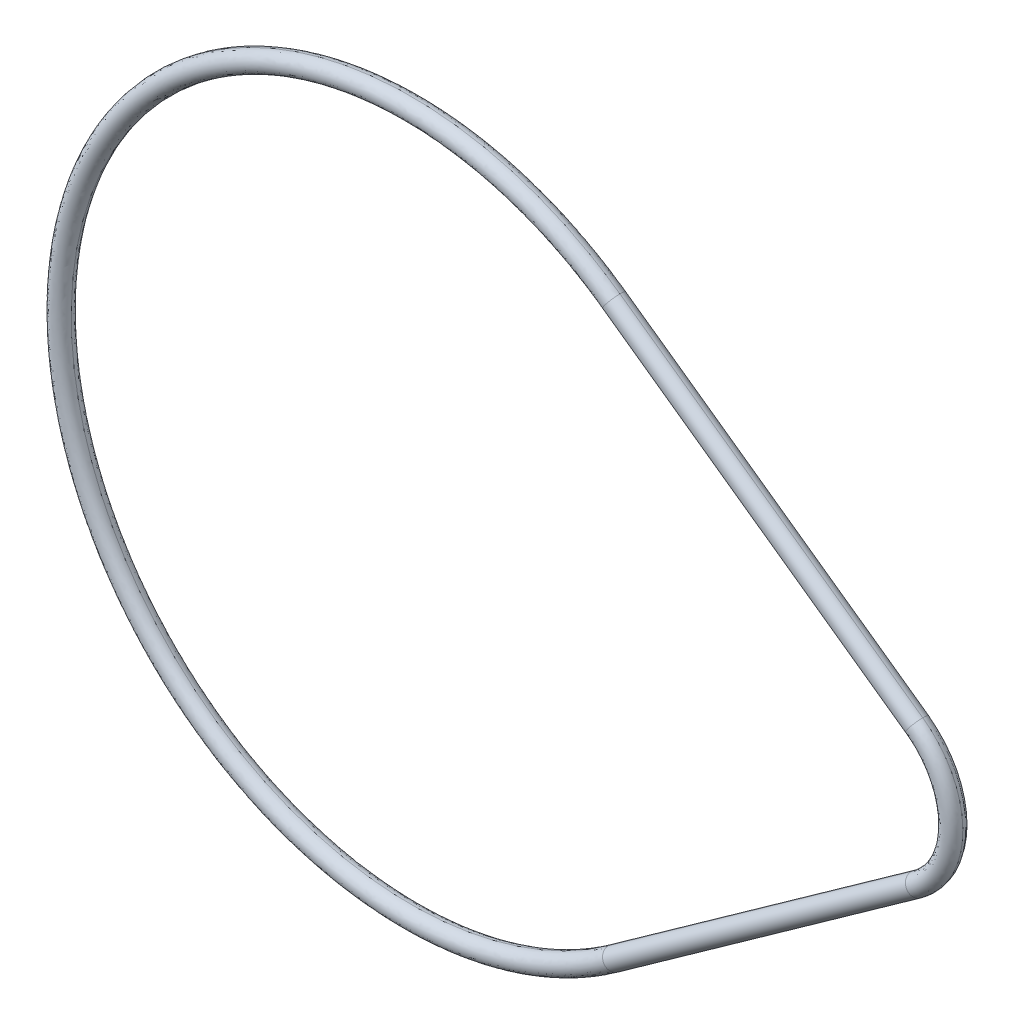
ISO-10303-21;
HEADER;
FILE_DESCRIPTION(('STEP AP214'),'2;1');
FILE_NAME('part.step','',(''),(''),'','','');
FILE_SCHEMA(('AUTOMOTIVE_DESIGN { 1 0 10303 214 1 1 1 1 }'));
ENDSEC;
DATA;
#1=APPLICATION_CONTEXT('core data for automotive mechanical design processes');
#2=APPLICATION_PROTOCOL_DEFINITION('international standard','automotive_design',2000,#1);
#3=PRODUCT_CONTEXT('',#1,'mechanical');
#4=PRODUCT('Part','Part','',(#3));
#5=PRODUCT_RELATED_PRODUCT_CATEGORY('part','',(#4));
#6=PRODUCT_DEFINITION_FORMATION('','',#4);
#7=PRODUCT_DEFINITION_CONTEXT('part definition',#1,'design');
#8=PRODUCT_DEFINITION('design','',#6,#7);
#9=PRODUCT_DEFINITION_SHAPE('','',#8);
#10=(LENGTH_UNIT() NAMED_UNIT(*) SI_UNIT(.MILLI.,.METRE.));
#11=(NAMED_UNIT(*) PLANE_ANGLE_UNIT() SI_UNIT($,.RADIAN.));
#12=(NAMED_UNIT(*) SI_UNIT($,.STERADIAN.) SOLID_ANGLE_UNIT());
#13=UNCERTAINTY_MEASURE_WITH_UNIT(LENGTH_MEASURE(1.E-05),#10,'distance_accuracy_value','');
#14=(GEOMETRIC_REPRESENTATION_CONTEXT(3) GLOBAL_UNCERTAINTY_ASSIGNED_CONTEXT((#13)) GLOBAL_UNIT_ASSIGNED_CONTEXT((#10,
#11,#12)) REPRESENTATION_CONTEXT('',''));
#15=CARTESIAN_POINT('',(0.,0.,0.));
#16=DIRECTION('',(0.,0.,1.));
#17=DIRECTION('',(1.,0.,0.));
#18=AXIS2_PLACEMENT_3D('',#15,#16,#17);
#19=CARTESIAN_POINT('',(20.8161999194433,-29.2365851450577,-0.000527050012894062));
#20=CARTESIAN_POINT('',(-5.33979762134282,-47.8594328955761,-0.000527050012904014));
#21=CARTESIAN_POINT('',(-26.7480982643424,-23.9297164477879,-0.000527050012908594));
#22=CARTESIAN_POINT('',(-48.156398907342,0.,-0.000527050012913173));
#23=CARTESIAN_POINT('',(-26.748098264342,23.9297164477884,-0.000527050012904236));
#24=CARTESIAN_POINT('',(-5.339797621342,47.8594328955762,-0.000527050012895298));
#25=CARTESIAN_POINT('',(20.816199919444,29.2365851450574,-0.000527050012888737));
#26=CARTESIAN_POINT('',(20.8162,-29.2365852582005,-0.00026352502464842));
#27=CARTESIAN_POINT('',(-5.33979764200732,-47.8594330807876,-0.000263525024658373));
#28=CARTESIAN_POINT('',(-26.748098367855,-23.9297165403936,-0.000263525024662952));
#29=CARTESIAN_POINT('',(-48.1563990937028,0.,-0.000263525024667531));
#30=CARTESIAN_POINT('',(-26.7480983678546,23.9297165403941,-0.000263525024658594));
#31=CARTESIAN_POINT('',(-5.33979764200651,47.8594330807877,-0.000263525024649656));
#32=CARTESIAN_POINT('',(20.8162000000007,29.2365852582002,-0.000263525024643095));
#33=CARTESIAN_POINT('',(20.8162,-29.2365852582005,1.98441115552759E-13));
#34=CARTESIAN_POINT('',(-5.33979764200732,-47.8594330807876,1.88488159173581E-13));
#35=CARTESIAN_POINT('',(-26.748098367855,-23.9297165403936,1.8390899366285E-13));
#36=CARTESIAN_POINT('',(-48.1563990937027,0.,1.79329828152119E-13));
#37=CARTESIAN_POINT('',(-26.7480983678546,23.9297165403941,1.8826726768798E-13));
#38=CARTESIAN_POINT('',(-5.33979764200651,47.8594330807877,1.9720470722384E-13));
#39=CARTESIAN_POINT('',(20.8162000000007,29.2365852582002,2.03765919542777E-13));
#40=CARTESIAN_POINT('',(20.8162000000002,-29.2365852582005,1.00000000000019));
#41=CARTESIAN_POINT('',(-5.33979764200732,-47.8594330807876,1.00000000000018));
#42=CARTESIAN_POINT('',(-26.748098367855,-23.9297165403936,1.00000000000017));
#43=CARTESIAN_POINT('',(-48.1563990937027,0.,1.00000000000017));
#44=CARTESIAN_POINT('',(-26.7480983678546,23.9297165403941,1.00000000000018));
#45=CARTESIAN_POINT('',(-5.33979764200651,47.8594330807878,1.00000000000018));
#46=CARTESIAN_POINT('',(20.8162000000007,29.2365852582002,1.00000000000019));
#47=CARTESIAN_POINT('',(20.2362,-28.4219687840239,1.00000000000019));
#48=CARTESIAN_POINT('',(-5.19101531706981,-46.5259297907128,1.00000000000018));
#49=CARTESIAN_POINT('',(-26.002818391041,-23.2629648953562,1.00000000000017));
#50=CARTESIAN_POINT('',(-46.8146214650122,0.,1.00000000000017));
#51=CARTESIAN_POINT('',(-26.0028183910406,23.2629648953566,1.00000000000018));
#52=CARTESIAN_POINT('',(-5.19101531706902,46.5259297907128,1.00000000000018));
#53=CARTESIAN_POINT('',(20.2362000000007,28.4219687840236,1.00000000000019));
#54=CARTESIAN_POINT('',(19.6562000000002,-27.6073523098472,1.00000000000019));
#55=CARTESIAN_POINT('',(-5.0422329921323,-45.1924265006379,1.00000000000018));
#56=CARTESIAN_POINT('',(-25.257538414227,-22.5962132503188,1.00000000000017));
#57=CARTESIAN_POINT('',(-45.4728438363218,0.,1.00000000000017));
#58=CARTESIAN_POINT('',(-25.2575384142266,22.5962132503192,1.00000000000018));
#59=CARTESIAN_POINT('',(-5.04223299213154,45.192426500638,1.00000000000018));
#60=CARTESIAN_POINT('',(19.6562000000007,27.6073523098469,1.00000000000019));
#61=CARTESIAN_POINT('',(19.6562,-27.6073523098472,1.98100819578805E-13));
#62=CARTESIAN_POINT('',(-5.0422329921323,-45.1924265006379,1.8870249994408E-13));
#63=CARTESIAN_POINT('',(-25.257538414227,-22.5962132503188,1.84378512227203E-13));
#64=CARTESIAN_POINT('',(-45.4728438363218,0.,1.80054524510327E-13));
#65=CARTESIAN_POINT('',(-25.2575384142266,22.5962132503192,1.88493917819614E-13));
#66=CARTESIAN_POINT('',(-5.04223299213154,45.192426500638,1.96933311128902E-13));
#67=CARTESIAN_POINT('',(19.6562000000007,27.6073523098469,2.03128894452634E-13));
#68=(BOUNDED_SURFACE() B_SPLINE_SURFACE(2,2,((#19,#20,#21,#22,#23,#24,#25),(#26,#27,#28,#29,#30,
#31,#32),(#33,#34,#35,#36,#37,#38,#39),(#40,#41,#42,#43,#44,#45,#46),(#47,#48,#49,#50,#51,#52,
#53),(#54,#55,#56,#57,#58,#59,#60),(#61,#62,#63,#64,#65,#66,#67)),.UNSPECIFIED.,.F.,.F.,
.F.) B_SPLINE_SURFACE_WITH_KNOTS((3,2,2,3),(3,2,2,3),(-0.000585341525006589,0.,1.5707963267949,
3.14159265358979),(-2.18952501746714,-0.729841672489042,0.729841672489059,2.18952501746716),
.UNSPECIFIED.) GEOMETRIC_REPRESENTATION_ITEM() RATIONAL_B_SPLINE_SURFACE(((0.999781793891307,
0.745117352170373,0.999781793891307,0.745117352170373,0.999781793891307,0.745117352170373,
0.999781793891307),(0.999890856274337,0.745198634180668,0.999890856274337,0.745198634180668,
0.999890856274337,0.745198634180668,0.999890856274337),(1.,0.745279976814,1.,0.745279976814,1.,
0.745279976814,1.),(0.707106781186543,0.526992525487729,0.707106781186543,0.526992525487729,
0.707106781186543,0.526992525487729,0.707106781186543),(1.,0.745279976814,1.,0.745279976814,1.,
0.745279976814,1.),(0.707106781186543,0.526992525487729,0.707106781186543,0.526992525487729,
0.707106781186543,0.526992525487729,0.707106781186543),(1.,0.745279976814,1.,0.745279976814,1.,
0.745279976814,1.))) REPRESENTATION_ITEM('') SURFACE());
#69=CARTESIAN_POINT('',(20.8162000007653,-29.2365852592919,-2.96036312421354E-10));
#70=CARTESIAN_POINT('',(-5.33979764200732,-47.8594330807876,1.88488159173581E-13));
#71=CARTESIAN_POINT('',(-26.748098367855,-23.9297165403936,1.8390899366285E-13));
#72=CARTESIAN_POINT('',(-48.1563990937027,0.,1.79329828152119E-13));
#73=CARTESIAN_POINT('',(-26.7480983678546,23.9297165403941,1.8826726768798E-13));
#74=CARTESIAN_POINT('',(-5.33979764200651,47.8594330807877,1.9720470722384E-13));
#75=CARTESIAN_POINT('',(20.8161999999804,29.2365852581906,-3.20402871304821E-10));
#76=(BOUNDED_CURVE() B_SPLINE_CURVE(2,(#69,#70,#71,#72,#73,#74,#75),.UNSPECIFIED.,.F.,
.F.) B_SPLINE_CURVE_WITH_KNOTS((3,2,2,3),(-2.18952501746714,-0.729841672489042,
0.729841672489059,2.18952501746716),
.UNSPECIFIED.) CURVE() GEOMETRIC_REPRESENTATION_ITEM() RATIONAL_B_SPLINE_CURVE((1.,
0.745279976814,1.,0.745279976814,1.,0.745279976814,1.)) REPRESENTATION_ITEM(''));
#77=CARTESIAN_POINT('',(20.8162000007653,-29.2365852592919,-2.96036312421354E-10));
#78=VERTEX_POINT('',#77);
#79=CARTESIAN_POINT('',(20.8161999999804,29.2365852581906,-3.20402871304821E-10));
#80=VERTEX_POINT('',#79);
#81=EDGE_CURVE('E92',#78,#80,#76,.T.);
#82=CARTESIAN_POINT('',(20.8162000007653,-29.2365852592919,-2.96036312421354E-10));
#83=CARTESIAN_POINT('',(20.816200000077,-29.2365852583084,0.41421356217648));
#84=CARTESIAN_POINT('',(20.6463219331499,-28.9979896170669,0.707106781104263));
#85=CARTESIAN_POINT('',(20.4764438662229,-28.7593939758255,1.00000000003204));
#86=CARTESIAN_POINT('',(20.2362,-28.421968784,1.));
#87=(BOUNDED_CURVE() B_SPLINE_CURVE(2,(#82,#83,#84,#85,#86),.UNSPECIFIED.,.F.,
.F.) B_SPLINE_CURVE_WITH_KNOTS((3,2,3),(-3.20049603350145E-10,0.785398163247126,
1.5707963268143),
.UNSPECIFIED.) CURVE() GEOMETRIC_REPRESENTATION_ITEM() RATIONAL_B_SPLINE_CURVE((1.,
0.923879532478738,1.,0.923879532478833,1.)) REPRESENTATION_ITEM(''));
#88=CARTESIAN_POINT('',(20.2362,-28.421968784,1.));
#89=VERTEX_POINT('',#88);
#90=EDGE_CURVE('E164',#78,#89,#87,.T.);
#91=CARTESIAN_POINT('',(20.2362,-28.421968784,1.));
#92=CARTESIAN_POINT('',(19.6561999999863,-27.6073523098277,1.00000000000458));
#93=CARTESIAN_POINT('',(19.6562,-27.6073523098472,1.98345748938635E-13));
#94=(BOUNDED_CURVE() B_SPLINE_CURVE(2,(#91,#92,#93),.UNSPECIFIED.,.F.,
.F.) B_SPLINE_CURVE_WITH_KNOTS((3,3),(-4.71238898036528,-3.14159265356601),
.UNSPECIFIED.) CURVE() GEOMETRIC_REPRESENTATION_ITEM() RATIONAL_B_SPLINE_CURVE((1.,
0.707106781185001,1.)) REPRESENTATION_ITEM(''));
#95=CARTESIAN_POINT('',(19.6562,-27.6073523098472,1.98345748938635E-13));
#96=VERTEX_POINT('',#95);
#97=EDGE_CURVE('E156',#89,#96,#94,.T.);
#98=CARTESIAN_POINT('',(19.6562,-27.6073523098472,1.98345748938635E-13));
#99=CARTESIAN_POINT('',(-5.0422329921323,-45.1924265006379,1.8870249994408E-13));
#100=CARTESIAN_POINT('',(-25.257538414227,-22.5962132503188,1.84378512227203E-13));
#101=CARTESIAN_POINT('',(-45.4728438363218,0.,1.80054524510327E-13));
#102=CARTESIAN_POINT('',(-25.2575384142266,22.5962132503192,1.88493917819614E-13));
#103=CARTESIAN_POINT('',(-5.04223299213154,45.192426500638,1.96933311128902E-13));
#104=CARTESIAN_POINT('',(19.6562000000007,27.6073523098469,2.03373823812464E-13));
#105=(BOUNDED_CURVE() B_SPLINE_CURVE(2,(#98,#99,#100,#101,#102,#103,#104),.UNSPECIFIED.,.F.,
.F.) B_SPLINE_CURVE_WITH_KNOTS((3,2,2,3),(-2.18952501746714,-0.729841672489042,
0.729841672489059,2.18952501746716),
.UNSPECIFIED.) CURVE() GEOMETRIC_REPRESENTATION_ITEM() RATIONAL_B_SPLINE_CURVE((1.,
0.745279976814,1.,0.745279976814,1.,0.745279976814,1.)) REPRESENTATION_ITEM(''));
#106=CARTESIAN_POINT('',(19.6562000000007,27.6073523098469,2.03373823812464E-13));
#107=VERTEX_POINT('',#106);
#108=EDGE_CURVE('E107',#96,#107,#105,.T.);
#109=CARTESIAN_POINT('',(20.8161999999804,29.2365852581906,-3.20402871304821E-10));
#110=CARTESIAN_POINT('',(20.8162000001206,29.2365852583687,0.577350268940353));
#111=CARTESIAN_POINT('',(20.5262000001207,28.8292770212805,0.866025403677556));
#112=CARTESIAN_POINT('',(20.2362000001207,28.4219687841922,1.15470053841476));
#113=CARTESIAN_POINT('',(19.9462000000671,28.0146605470285,0.866025403837859));
#114=CARTESIAN_POINT('',(19.6562000000134,27.6073523098649,0.577350269260959));
#115=CARTESIAN_POINT('',(19.6562000000007,27.6073523098469,2.03373823812464E-13));
#116=(BOUNDED_CURVE() B_SPLINE_CURVE(2,(#109,#110,#111,#112,#113,#114,#115),.UNSPECIFIED.,.F.,
.F.) B_SPLINE_CURVE_WITH_KNOTS((3,2,2,3),(-1.57079632711525,-0.523598775811962,
0.523598775491331,1.57079632679462),
.UNSPECIFIED.) CURVE() GEOMETRIC_REPRESENTATION_ITEM() RATIONAL_B_SPLINE_CURVE((1.,
0.866025403757778,1.,0.866025403757765,1.,0.866025403757799,1.)) REPRESENTATION_ITEM(''));
#117=EDGE_CURVE('E132',#80,#107,#116,.T.);
#118=ORIENTED_EDGE('',*,*,#81,.F.);
#119=ORIENTED_EDGE('',*,*,#90,.T.);
#120=ORIENTED_EDGE('',*,*,#97,.T.);
#121=ORIENTED_EDGE('',*,*,#108,.T.);
#122=ORIENTED_EDGE('',*,*,#117,.F.);
#123=EDGE_LOOP('',(#118,#119,#120,#121,#122));
#124=FACE_BOUND('',#123,.T.);
#125=ADVANCED_FACE('F17',(#124),#68,.T.);
#126=CARTESIAN_POINT('',(51.0100000005733,-7.73885650542854,2.96036312419443E-10));
#127=CARTESIAN_POINT('',(51.0100000005863,-7.73885650541927,-1.00000000030818));
#128=CARTESIAN_POINT('',(50.4300000002273,-6.92424003075651,-1.00000000030818));
#129=CARTESIAN_POINT('',(49.8499999998683,-6.10962355609375,-1.00000000030818));
#130=CARTESIAN_POINT('',(49.8499999998553,-6.10962355610301,2.96036312419443E-10));
#131=CARTESIAN_POINT('',(49.8499999998553,-6.10962355610301,0.000353605470908468));
#132=CARTESIAN_POINT('',(49.8500001448978,-6.10962375981677,0.000707210557353443));
#133=CARTESIAN_POINT('',(20.8162000007653,-29.2365852592919,-2.96036312421354E-10));
#134=CARTESIAN_POINT('',(20.8162000007783,-29.2365852592826,-1.00000000090026));
#135=CARTESIAN_POINT('',(20.2362000004193,-28.4219687846199,-1.00000000090026));
#136=CARTESIAN_POINT('',(19.6562000000603,-27.6073523099571,-1.00000000090026));
#137=CARTESIAN_POINT('',(19.6562000000472,-27.6073523099664,-2.96036312421354E-10));
#138=CARTESIAN_POINT('',(19.6562000000472,-27.6073523099664,0.000353604878835844));
#139=CARTESIAN_POINT('',(19.6562001450896,-27.6073525136801,0.000707209965280819));
#140=(BOUNDED_SURFACE() B_SPLINE_SURFACE(1,2,((#126,#127,#128,#129,#130,#131,#132),(#133,#134,
#135,#136,#137,#138,#139)),.UNSPECIFIED.,.F.,.F.,.F.) B_SPLINE_SURFACE_WITH_KNOTS((2,2),(3,2,2,
3),(-18.5325247764019,18.5325247762823),(-3.14159265358979,-1.5707963267949,0.,
0.000785398162922866),
.UNSPECIFIED.) GEOMETRIC_REPRESENTATION_ITEM() RATIONAL_B_SPLINE_SURFACE(((1.,0.707106781186548,
1.,0.707106781186548,1.,0.999853553390682,0.999707253227973),(1.,0.707106781186548,1.,
0.707106781186548,1.,0.999853553390682,0.999707253227973))) REPRESENTATION_ITEM('') SURFACE());
#141=CARTESIAN_POINT('',(49.85,-6.10962355632446,0.));
#142=CARTESIAN_POINT('',(19.6562,-27.6073523098472,1.98345748938635E-13));
#143=(BOUNDED_CURVE() B_SPLINE_CURVE(1,(#141,#142),.UNSPECIFIED.,.F.,
.F.) B_SPLINE_CURVE_WITH_KNOTS((2,2),(-18.5325247764019,18.5325247762823),
.UNSPECIFIED.) CURVE() GEOMETRIC_REPRESENTATION_ITEM() RATIONAL_B_SPLINE_CURVE((1.,1.)) REPRESENTATION_ITEM(''));
#144=CARTESIAN_POINT('',(49.85,-6.10962355632446,0.));
#145=VERTEX_POINT('',#144);
#146=EDGE_CURVE('E148',#145,#96,#143,.T.);
#147=CARTESIAN_POINT('',(50.43,-6.924240031,-1.));
#148=CARTESIAN_POINT('',(50.1897561339056,-6.58681483888037,-1.00000000066587));
#149=CARTESIAN_POINT('',(50.0198780668931,-6.34821919751896,-0.707106781651809));
#150=CARTESIAN_POINT('',(49.8499999998808,-6.10962355615754,-0.414213562637741));
#151=CARTESIAN_POINT('',(49.85,-6.10962355632446,0.));
#152=(BOUNDED_CURVE() B_SPLINE_CURVE(2,(#147,#148,#149,#150,#151),.UNSPECIFIED.,.F.,
.F.) B_SPLINE_CURVE_WITH_KNOTS((3,2,3),(-1.57079632720026,-0.785398163351192,
4.97871521787374E-10),
.UNSPECIFIED.) CURVE() GEOMETRIC_REPRESENTATION_ITEM() RATIONAL_B_SPLINE_CURVE((1.,
0.923879532424903,1.,0.92387953242487,1.)) REPRESENTATION_ITEM(''));
#153=CARTESIAN_POINT('',(50.43,-6.924240031,-1.));
#154=VERTEX_POINT('',#153);
#155=EDGE_CURVE('E32',#154,#145,#152,.T.);
#156=CARTESIAN_POINT('',(51.0100000005733,-7.73885650542854,2.96036312419443E-10));
#157=CARTESIAN_POINT('',(51.0100000001911,-7.73885650494675,-0.414213562190889));
#158=CARTESIAN_POINT('',(50.8401219333344,-7.5002608638042,-0.707106781260477));
#159=CARTESIAN_POINT('',(50.6702438664778,-7.26166522266165,-1.00000000033006));
#160=CARTESIAN_POINT('',(50.43,-6.924240031,-1.));
#161=(BOUNDED_CURVE() B_SPLINE_CURVE(2,(#156,#157,#158,#159,#160),.UNSPECIFIED.,.F.,
.F.) B_SPLINE_CURVE_WITH_KNOTS((3,2,3),(3.14159265279579,3.92699081638756,4.71238897997933),
.UNSPECIFIED.) CURVE() GEOMETRIC_REPRESENTATION_ITEM() RATIONAL_B_SPLINE_CURVE((1.,
0.923879532474089,1.,0.923879532474099,1.)) REPRESENTATION_ITEM(''));
#162=CARTESIAN_POINT('',(51.0100000005733,-7.73885650542854,2.96036312419443E-10));
#163=VERTEX_POINT('',#162);
#164=EDGE_CURVE('E77',#163,#154,#161,.T.);
#165=CARTESIAN_POINT('',(51.0100000005733,-7.73885650542854,2.96036312419443E-10));
#166=CARTESIAN_POINT('',(20.8162000007653,-29.2365852592919,-2.96036312421354E-10));
#167=(BOUNDED_CURVE() B_SPLINE_CURVE(1,(#165,#166),.UNSPECIFIED.,.F.,
.F.) B_SPLINE_CURVE_WITH_KNOTS((2,2),(-18.5325247764019,18.5325247762823),
.UNSPECIFIED.) CURVE() GEOMETRIC_REPRESENTATION_ITEM() RATIONAL_B_SPLINE_CURVE((1.,1.)) REPRESENTATION_ITEM(''));
#168=EDGE_CURVE('E140',#163,#78,#167,.T.);
#169=CARTESIAN_POINT('',(19.6562,-27.6073523098472,1.98345748938635E-13));
#170=CARTESIAN_POINT('',(19.6562000000139,-27.6073523098665,-0.999999999827884));
#171=CARTESIAN_POINT('',(20.2361999999142,-28.4219687839031,-0.999999999976001));
#172=CARTESIAN_POINT('',(20.8161999998145,-29.2365852579397,-1.00000000012412));
#173=CARTESIAN_POINT('',(20.8162000007653,-29.2365852592919,-2.96036312421354E-10));
#174=(BOUNDED_CURVE() B_SPLINE_CURVE(2,(#169,#170,#171,#172,#173),.UNSPECIFIED.,.F.,
.F.) B_SPLINE_CURVE_WITH_KNOTS((3,2,3),(-3.14159265356601,-1.57079632694303,
-3.20050208557632E-10),
.UNSPECIFIED.) CURVE() GEOMETRIC_REPRESENTATION_ITEM() RATIONAL_B_SPLINE_CURVE((1.,
0.707106781247326,1.,0.707106781247328,1.)) REPRESENTATION_ITEM(''));
#175=EDGE_CURVE('E184',#96,#78,#174,.T.);
#176=ORIENTED_EDGE('',*,*,#146,.F.);
#177=ORIENTED_EDGE('',*,*,#155,.F.);
#178=ORIENTED_EDGE('',*,*,#164,.F.);
#179=ORIENTED_EDGE('',*,*,#168,.T.);
#180=ORIENTED_EDGE('',*,*,#175,.F.);
#181=EDGE_LOOP('',(#176,#177,#178,#179,#180));
#182=FACE_BOUND('',#181,.T.);
#183=ADVANCED_FACE('F355',(#182),#140,.T.);
#184=CARTESIAN_POINT('',(51.0099998854202,7.73885634374881,-0.000628572010337216));
#185=CARTESIAN_POINT('',(54.999999802448,4.89801034414475,-0.000628572010337029));
#186=CARTESIAN_POINT('',(54.999999802448,0.,-0.000628572010337148));
#187=CARTESIAN_POINT('',(54.9999998024479,-4.89801034414505,-0.000628572010337266));
#188=CARTESIAN_POINT('',(51.0099998854202,-7.73885634374916,-0.00062857201033759));
#189=CARTESIAN_POINT('',(51.0099999999999,7.73885650467743,-0.000314286036261268));
#190=CARTESIAN_POINT('',(54.9999999999994,4.89801044599831,-0.000314286036261081));
#191=CARTESIAN_POINT('',(54.9999999999994,0.,-0.0003142860362612));
#192=CARTESIAN_POINT('',(54.9999999999993,-4.89801044599861,-0.000314286036261318));
#193=CARTESIAN_POINT('',(51.0099999999999,-7.73885650467778,-0.000314286036261642));
#194=CARTESIAN_POINT('',(51.01,7.73885650467744,0.));
#195=CARTESIAN_POINT('',(54.9999999999994,4.89801044599831,0.));
#196=CARTESIAN_POINT('',(54.9999999999994,0.,0.));
#197=CARTESIAN_POINT('',(54.9999999999993,-4.89801044599861,0.));
#198=CARTESIAN_POINT('',(51.01,-7.73885650467779,0.));
#199=CARTESIAN_POINT('',(51.01,7.73885650467744,0.999999999999904));
#200=CARTESIAN_POINT('',(54.9999999999994,4.89801044599831,0.999999999999903));
#201=CARTESIAN_POINT('',(54.9999999999994,0.,0.999999999999904));
#202=CARTESIAN_POINT('',(54.9999999999993,-4.89801044599861,0.999999999999903));
#203=CARTESIAN_POINT('',(51.0099999999995,-7.7388565046778,0.999999999999904));
#204=CARTESIAN_POINT('',(50.43,6.92424003050081,0.999999999999903));
#205=CARTESIAN_POINT('',(53.9999999999994,4.38243039905108,0.999999999999903));
#206=CARTESIAN_POINT('',(53.9999999999994,0.,0.999999999999903));
#207=CARTESIAN_POINT('',(53.9999999999993,-4.38243039905135,0.999999999999903));
#208=CARTESIAN_POINT('',(50.43,-6.92424003050112,0.999999999999903));
#209=CARTESIAN_POINT('',(49.8499999999999,6.10962355632418,0.999999999999904));
#210=CARTESIAN_POINT('',(52.9999999999994,3.86685035210386,0.999999999999903));
#211=CARTESIAN_POINT('',(52.9999999999994,0.,0.999999999999904));
#212=CARTESIAN_POINT('',(52.9999999999993,-3.86685035210409,0.999999999999903));
#213=CARTESIAN_POINT('',(49.8499999999995,-6.10962355632447,0.999999999999904));
#214=CARTESIAN_POINT('',(49.85,6.10962355632418,0.));
#215=CARTESIAN_POINT('',(52.9999999999995,3.86685035210386,0.));
#216=CARTESIAN_POINT('',(52.9999999999994,0.,0.));
#217=CARTESIAN_POINT('',(52.9999999999993,-3.86685035210409,0.));
#218=CARTESIAN_POINT('',(49.85,-6.10962355632446,0.));
#219=(BOUNDED_SURFACE() B_SPLINE_SURFACE(2,2,((#184,#185,#186,#187,#188),(#189,#190,#191,#192,
#193),(#194,#195,#196,#197,#198),(#199,#200,#201,#202,#203),(#204,#205,#206,#207,#208),(#209,
#210,#211,#212,#213),(#214,#215,#216,#217,#218)),.UNSPECIFIED.,.F.,.F.,
.F.) B_SPLINE_SURFACE_WITH_KNOTS((3,2,2,3),(3,2,3),(-0.000698077157127888,0.,1.5707963267949,
3.14159265358979),(2.18952501746719,3.1415926535898,4.09366028971246),
.UNSPECIFIED.) GEOMETRIC_REPRESENTATION_ITEM() RATIONAL_B_SPLINE_SURFACE(((0.999739786505589,
0.888588158918728,0.999739786505589,0.888588158918728,0.999739786505589),(0.999869835406384,
0.888703748910131,0.999869835406384,0.888703748910131,0.999869835406384),(1.,0.888819441731562,
1.,0.888819441731562,1.),(0.707106781186542,0.628490254498824,0.707106781186542,
0.628490254498824,0.707106781186542),(1.,0.888819441731562,1.,0.888819441731562,1.),
(0.707106781186541,0.628490254498823,0.707106781186541,0.628490254498823,0.707106781186541),(1.,
0.888819441731562,1.,0.888819441731562,1.))) REPRESENTATION_ITEM('') SURFACE());
#220=CARTESIAN_POINT('',(51.01,7.738856505,0.));
#221=CARTESIAN_POINT('',(54.9999999999994,4.89801044599831,0.));
#222=CARTESIAN_POINT('',(54.9999999999994,0.,0.));
#223=CARTESIAN_POINT('',(54.9999999999993,-4.89801044599861,0.));
#224=CARTESIAN_POINT('',(51.0100000005733,-7.73885650542854,2.96036312419443E-10));
#225=(BOUNDED_CURVE() B_SPLINE_CURVE(2,(#220,#221,#222,#223,#224),.UNSPECIFIED.,.F.,
.F.) B_SPLINE_CURVE_WITH_KNOTS((3,2,3),(2.18952501746719,3.1415926535898,4.09366028971246),
.UNSPECIFIED.) CURVE() GEOMETRIC_REPRESENTATION_ITEM() RATIONAL_B_SPLINE_CURVE((1.,
0.888819441731562,1.,0.888819441731562,1.)) REPRESENTATION_ITEM(''));
#226=CARTESIAN_POINT('',(51.01,7.738856505,0.));
#227=VERTEX_POINT('',#226);
#228=EDGE_CURVE('E125',#227,#163,#225,.T.);
#229=CARTESIAN_POINT('',(49.85,6.10962355632418,0.));
#230=CARTESIAN_POINT('',(49.8499999997106,6.10962355591769,1.00000000000011));
#231=CARTESIAN_POINT('',(50.4299999997107,6.92424003009451,1.00000000000016));
#232=CARTESIAN_POINT('',(51.0099999997108,7.73885650427134,1.00000000000021));
#233=CARTESIAN_POINT('',(51.01,7.738856505,0.));
#234=(BOUNDED_CURVE() B_SPLINE_CURVE(2,(#229,#230,#231,#232,#233),.UNSPECIFIED.,.F.,
.F.) B_SPLINE_CURVE_WITH_KNOTS((3,2,3),(1.57079632679463,3.14159265358974,4.71238898038484),
.UNSPECIFIED.) CURVE() GEOMETRIC_REPRESENTATION_ITEM() RATIONAL_B_SPLINE_CURVE((1.,
0.707106781186476,1.,0.707106781186473,1.)) REPRESENTATION_ITEM(''));
#235=CARTESIAN_POINT('',(49.85,6.10962355632418,0.));
#236=VERTEX_POINT('',#235);
#237=EDGE_CURVE('E126',#236,#227,#234,.T.);
#238=CARTESIAN_POINT('',(49.85,6.10962355632418,0.));
#239=CARTESIAN_POINT('',(52.9999999999995,3.86685035210386,0.));
#240=CARTESIAN_POINT('',(52.9999999999994,0.,0.));
#241=CARTESIAN_POINT('',(52.9999999999993,-3.86685035210409,0.));
#242=CARTESIAN_POINT('',(49.85,-6.10962355632446,0.));
#243=(BOUNDED_CURVE() B_SPLINE_CURVE(2,(#238,#239,#240,#241,#242),.UNSPECIFIED.,.F.,
.F.) B_SPLINE_CURVE_WITH_KNOTS((3,2,3),(2.18952501746719,3.1415926535898,4.09366028971246),
.UNSPECIFIED.) CURVE() GEOMETRIC_REPRESENTATION_ITEM() RATIONAL_B_SPLINE_CURVE((1.,
0.888819441731562,1.,0.888819441731562,1.)) REPRESENTATION_ITEM(''));
#244=EDGE_CURVE('E11',#236,#145,#243,.T.);
#245=CARTESIAN_POINT('',(49.85,-6.10962355632446,0.));
#246=CARTESIAN_POINT('',(49.8500000002891,-6.10962355673111,0.999999999353963));
#247=CARTESIAN_POINT('',(50.4299999999144,-6.92424003038157,0.999999999502031));
#248=CARTESIAN_POINT('',(51.0099999995398,-7.73885650403203,0.999999999650098));
#249=CARTESIAN_POINT('',(51.0100000005733,-7.73885650542854,2.96036312419443E-10));
#250=(BOUNDED_CURVE() B_SPLINE_CURVE(2,(#245,#246,#247,#248,#249),.UNSPECIFIED.,.F.,
.F.) B_SPLINE_CURVE_WITH_KNOTS((3,2,3),(4.9787148463695E-10,1.57079632664683,3.14159265279579),
.UNSPECIFIED.) CURVE() GEOMETRIC_REPRESENTATION_ITEM() RATIONAL_B_SPLINE_CURVE((1.,
0.707106781414916,1.,0.707106781414919,1.)) REPRESENTATION_ITEM(''));
#251=EDGE_CURVE('E157',#145,#163,#250,.T.);
#252=ORIENTED_EDGE('',*,*,#228,.F.);
#253=ORIENTED_EDGE('',*,*,#237,.F.);
#254=ORIENTED_EDGE('',*,*,#244,.T.);
#255=ORIENTED_EDGE('',*,*,#251,.T.);
#256=EDGE_LOOP('',(#252,#253,#254,#255));
#257=FACE_BOUND('',#256,.T.);
#258=ADVANCED_FACE('F127',(#257),#219,.T.);
#259=CARTESIAN_POINT('',(20.8161999999804,29.2365852581906,-3.20402871304821E-10));
#260=CARTESIAN_POINT('',(20.8161999999945,29.2365852581806,-1.00000000024847));
#261=CARTESIAN_POINT('',(20.2362000000277,28.4219687840686,-1.00000000024847));
#262=CARTESIAN_POINT('',(19.6562000000608,27.6073523099567,-1.00000000024847));
#263=CARTESIAN_POINT('',(19.6562000000468,27.6073523099667,-3.20402871304821E-10));
#264=CARTESIAN_POINT('',(19.6562000000468,27.6073523099667,0.000353604854469317));
#265=CARTESIAN_POINT('',(19.6562001450892,27.6073525136805,0.000707209940914325));
#266=CARTESIAN_POINT('',(51.009999999789,7.73885650432694,3.20402871302742E-10));
#267=CARTESIAN_POINT('',(51.0099999998031,7.73885650431691,-0.999999999607669));
#268=CARTESIAN_POINT('',(50.4299999998362,6.92424003020495,-0.999999999607668));
#269=CARTESIAN_POINT('',(49.8499999998694,6.10962355609299,-0.999999999607669));
#270=CARTESIAN_POINT('',(49.8499999998553,6.10962355610301,3.20402871302742E-10));
#271=CARTESIAN_POINT('',(49.8499999998553,6.10962355610302,0.000353605495275059));
#272=CARTESIAN_POINT('',(49.8500001448977,6.10962375981677,0.000707210581720066));
#273=(BOUNDED_SURFACE() B_SPLINE_SURFACE(1,2,((#259,#260,#261,#262,#263,#264,#265),(#266,#267,
#268,#269,#270,#271,#272)),.UNSPECIFIED.,.F.,.F.,.F.) B_SPLINE_SURFACE_WITH_KNOTS((2,2),(3,2,2,
3),(-18.5325247888129,18.5325247889331),(-3.14159265358979,-1.5707963267949,0.,
0.000785398163453904),
.UNSPECIFIED.) GEOMETRIC_REPRESENTATION_ITEM() RATIONAL_B_SPLINE_SURFACE(((1.,0.707106781186548,
1.,0.707106781186548,1.,0.999853553390583,0.999707253227775),(1.,0.707106781186548,1.,
0.707106781186548,1.,0.999853553390583,0.999707253227775))) REPRESENTATION_ITEM('') SURFACE());
#274=CARTESIAN_POINT('',(19.6562000000007,27.6073523098469,2.03373823812464E-13));
#275=CARTESIAN_POINT('',(49.85,6.10962355632418,0.));
#276=(BOUNDED_CURVE() B_SPLINE_CURVE(1,(#274,#275),.UNSPECIFIED.,.F.,
.F.) B_SPLINE_CURVE_WITH_KNOTS((2,2),(-18.5325247888129,18.5325247889331),
.UNSPECIFIED.) CURVE() GEOMETRIC_REPRESENTATION_ITEM() RATIONAL_B_SPLINE_CURVE((1.,1.)) REPRESENTATION_ITEM(''));
#277=EDGE_CURVE('E119',#107,#236,#276,.T.);
#278=CARTESIAN_POINT('',(19.6562000000007,27.6073523098469,2.03373823812464E-13));
#279=CARTESIAN_POINT('',(19.6562000000132,27.6073523098645,-0.999999999958599));
#280=CARTESIAN_POINT('',(20.2362,28.421968784,-1.));
#281=(BOUNDED_CURVE() B_SPLINE_CURVE(2,(#278,#279,#280),.UNSPECIFIED.,.F.,
.F.) B_SPLINE_CURVE_WITH_KNOTS((3,3),(1.57079632679462,3.14159265354832),
.UNSPECIFIED.) CURVE() GEOMETRIC_REPRESENTATION_ITEM() RATIONAL_B_SPLINE_CURVE((1.,
0.707106781201112,1.)) REPRESENTATION_ITEM(''));
#282=CARTESIAN_POINT('',(20.2362,28.421968784,-1.));
#283=VERTEX_POINT('',#282);
#284=EDGE_CURVE('E177',#107,#283,#281,.T.);
#285=CARTESIAN_POINT('',(20.2362,28.421968784,-1.));
#286=CARTESIAN_POINT('',(20.8161999998275,29.2365852579571,-1.00000000004152));
#287=CARTESIAN_POINT('',(20.8161999999804,29.2365852581906,-3.20402871304821E-10));
#288=(BOUNDED_CURVE() B_SPLINE_CURVE(2,(#285,#286,#287),.UNSPECIFIED.,.F.,
.F.) B_SPLINE_CURVE_WITH_KNOTS((3,3),(-3.14159265363126,-1.57079632711525),
.UNSPECIFIED.) CURVE() GEOMETRIC_REPRESENTATION_ITEM() RATIONAL_B_SPLINE_CURVE((1.,
0.707106781285147,1.)) REPRESENTATION_ITEM(''));
#289=EDGE_CURVE('E101',#283,#80,#288,.T.);
#290=CARTESIAN_POINT('',(20.8161999999804,29.2365852581906,-3.20402871304821E-10));
#291=CARTESIAN_POINT('',(51.01,7.738856505,0.));
#292=(BOUNDED_CURVE() B_SPLINE_CURVE(1,(#290,#291),.UNSPECIFIED.,.F.,
.F.) B_SPLINE_CURVE_WITH_KNOTS((2,2),(-18.5325247888129,18.5325247889331),
.UNSPECIFIED.) CURVE() GEOMETRIC_REPRESENTATION_ITEM() RATIONAL_B_SPLINE_CURVE((1.,1.)) REPRESENTATION_ITEM(''));
#293=EDGE_CURVE('E122',#80,#227,#292,.T.);
#294=CARTESIAN_POINT('',(51.01,7.738856505,0.));
#295=CARTESIAN_POINT('',(51.0099999997107,7.73885650427108,-0.999999999999792));
#296=CARTESIAN_POINT('',(50.4299999997108,6.92424003009459,-0.99999999999984));
#297=CARTESIAN_POINT('',(49.8499999997109,6.10962355591811,-0.99999999999989));
#298=CARTESIAN_POINT('',(49.85,6.10962355632418,0.));
#299=(BOUNDED_CURVE() B_SPLINE_CURVE(2,(#294,#295,#296,#297,#298),.UNSPECIFIED.,.F.,
.F.) B_SPLINE_CURVE_WITH_KNOTS((3,2,3),(-1.57079632679475,0.,1.57079632679463),
.UNSPECIFIED.) CURVE() GEOMETRIC_REPRESENTATION_ITEM() RATIONAL_B_SPLINE_CURVE((1.,
0.707106781186616,1.,0.707106781186628,1.)) REPRESENTATION_ITEM(''));
#300=EDGE_CURVE('E23',#227,#236,#299,.T.);
#301=ORIENTED_EDGE('',*,*,#277,.F.);
#302=ORIENTED_EDGE('',*,*,#284,.T.);
#303=ORIENTED_EDGE('',*,*,#289,.T.);
#304=ORIENTED_EDGE('',*,*,#293,.T.);
#305=ORIENTED_EDGE('',*,*,#300,.T.);
#306=EDGE_LOOP('',(#301,#302,#303,#304,#305));
#307=FACE_BOUND('',#306,.T.);
#308=ADVANCED_FACE('F117',(#307),#273,.T.);
#309=CARTESIAN_POINT('',(49.85,6.10962355632418,0.));
#310=CARTESIAN_POINT('',(52.9999999999995,3.86685035210386,0.));
#311=CARTESIAN_POINT('',(52.9999999999994,0.,0.));
#312=CARTESIAN_POINT('',(52.9999999999993,-3.86685035210409,0.));
#313=CARTESIAN_POINT('',(49.85,-6.10962355632446,0.));
#314=CARTESIAN_POINT('',(49.8499999999999,6.10962355632418,-1.0000000000001));
#315=CARTESIAN_POINT('',(52.9999999999994,3.86685035210386,-1.0000000000001));
#316=CARTESIAN_POINT('',(52.9999999999994,0.,-1.0000000000001));
#317=CARTESIAN_POINT('',(52.9999999999993,-3.86685035210409,-1.0000000000001));
#318=CARTESIAN_POINT('',(49.8499999999995,-6.10962355632446,-1.0000000000001));
#319=CARTESIAN_POINT('',(50.43,6.92424003050081,-1.0000000000001));
#320=CARTESIAN_POINT('',(53.9999999999994,4.38243039905108,-1.0000000000001));
#321=CARTESIAN_POINT('',(53.9999999999994,0.,-1.0000000000001));
#322=CARTESIAN_POINT('',(53.9999999999993,-4.38243039905135,-1.0000000000001));
#323=CARTESIAN_POINT('',(50.43,-6.92424003050112,-1.0000000000001));
#324=CARTESIAN_POINT('',(51.01,7.73885650467744,-1.0000000000001));
#325=CARTESIAN_POINT('',(54.9999999999994,4.89801044599831,-1.0000000000001));
#326=CARTESIAN_POINT('',(54.9999999999994,0.,-1.0000000000001));
#327=CARTESIAN_POINT('',(54.9999999999993,-4.89801044599861,-1.0000000000001));
#328=CARTESIAN_POINT('',(51.0099999999995,-7.7388565046778,-1.0000000000001));
#329=CARTESIAN_POINT('',(51.01,7.73885650467744,0.));
#330=CARTESIAN_POINT('',(54.9999999999994,4.89801044599831,0.));
#331=CARTESIAN_POINT('',(54.9999999999994,0.,0.));
#332=CARTESIAN_POINT('',(54.9999999999993,-4.89801044599861,0.));
#333=CARTESIAN_POINT('',(51.01,-7.73885650467779,0.));
#334=CARTESIAN_POINT('',(51.0099999999999,7.73885650467743,0.000314286036065904));
#335=CARTESIAN_POINT('',(54.9999999999994,4.89801044599831,0.000314286036066091));
#336=CARTESIAN_POINT('',(54.9999999999994,0.,0.000314286036065973));
#337=CARTESIAN_POINT('',(54.9999999999993,-4.89801044599861,0.000314286036065854));
#338=CARTESIAN_POINT('',(51.0099999999999,-7.73885650467778,0.00031428603606553));
#339=CARTESIAN_POINT('',(51.0099998854202,7.73885634374881,0.000628572010141832));
#340=CARTESIAN_POINT('',(54.999999802448,4.89801034414475,0.000628572010142019));
#341=CARTESIAN_POINT('',(54.999999802448,0.,0.000628572010141901));
#342=CARTESIAN_POINT('',(54.9999998024479,-4.89801034414505,0.000628572010141782));
#343=CARTESIAN_POINT('',(51.0099998854202,-7.73885634374916,0.000628572010141458));
#344=(BOUNDED_SURFACE() B_SPLINE_SURFACE(2,2,((#309,#310,#311,#312,#313),(#314,#315,#316,#317,
#318),(#319,#320,#321,#322,#323),(#324,#325,#326,#327,#328),(#329,#330,#331,#332,#333),(#334,
#335,#336,#337,#338),(#339,#340,#341,#342,#343)),.UNSPECIFIED.,.F.,.F.,
.F.) B_SPLINE_SURFACE_WITH_KNOTS((3,2,2,3),(3,2,3),(-3.14159265358979,-1.5707963267949,0.,
0.000698077157127888),(2.18952501746719,3.1415926535898,4.09366028971246),
.UNSPECIFIED.) GEOMETRIC_REPRESENTATION_ITEM() RATIONAL_B_SPLINE_SURFACE(((1.,0.888819441731562,
1.,0.888819441731562,1.),(0.707106781186542,0.628490254498824,0.707106781186542,
0.628490254498824,0.707106781186542),(1.,0.888819441731562,1.,0.888819441731562,1.),
(0.707106781186542,0.628490254498824,0.707106781186542,0.628490254498824,0.707106781186542),(1.,
0.888819441731562,1.,0.888819441731562,1.),(0.999869835406384,0.888703748910131,
0.999869835406384,0.888703748910131,0.999869835406384),(0.999739786505589,0.888588158918728,
0.999739786505589,0.888588158918728,0.999739786505589))) REPRESENTATION_ITEM('') SURFACE());
#345=ORIENTED_EDGE('',*,*,#300,.F.);
#346=ORIENTED_EDGE('',*,*,#228,.T.);
#347=ORIENTED_EDGE('',*,*,#164,.T.);
#348=ORIENTED_EDGE('',*,*,#155,.T.);
#349=ORIENTED_EDGE('',*,*,#244,.F.);
#350=EDGE_LOOP('',(#345,#346,#347,#348,#349));
#351=FACE_BOUND('',#350,.T.);
#352=ADVANCED_FACE('F115',(#351),#344,.T.);
#353=CARTESIAN_POINT('',(19.6562,-27.6073523098472,1.98100819578805E-13));
#354=CARTESIAN_POINT('',(-5.0422329921323,-45.1924265006379,1.8870249994408E-13));
#355=CARTESIAN_POINT('',(-25.257538414227,-22.5962132503188,1.84378512227203E-13));
#356=CARTESIAN_POINT('',(-45.4728438363218,0.,1.80054524510327E-13));
#357=CARTESIAN_POINT('',(-25.2575384142266,22.5962132503192,1.88493917819614E-13));
#358=CARTESIAN_POINT('',(-5.04223299213154,45.192426500638,1.96933311128902E-13));
#359=CARTESIAN_POINT('',(19.6562000000007,27.6073523098469,2.03128894452634E-13));
#360=CARTESIAN_POINT('',(19.6562000000002,-27.6073523098472,-0.999999999999789));
#361=CARTESIAN_POINT('',(-5.0422329921323,-45.1924265006379,-0.999999999999799));
#362=CARTESIAN_POINT('',(-25.257538414227,-22.5962132503188,-0.999999999999803));
#363=CARTESIAN_POINT('',(-45.4728438363218,0.,-0.999999999999806));
#364=CARTESIAN_POINT('',(-25.2575384142266,22.5962132503192,-0.999999999999799));
#365=CARTESIAN_POINT('',(-5.04223299213154,45.192426500638,-0.999999999999791));
#366=CARTESIAN_POINT('',(19.6562000000007,27.6073523098469,-0.999999999999784));
#367=CARTESIAN_POINT('',(20.2362,-28.4219687840239,-0.999999999999789));
#368=CARTESIAN_POINT('',(-5.19101531706981,-46.5259297907128,-0.999999999999799));
#369=CARTESIAN_POINT('',(-26.002818391041,-23.2629648953562,-0.999999999999803));
#370=CARTESIAN_POINT('',(-46.8146214650122,0.,-0.999999999999808));
#371=CARTESIAN_POINT('',(-26.0028183910406,23.2629648953566,-0.999999999999799));
#372=CARTESIAN_POINT('',(-5.19101531706902,46.5259297907128,-0.999999999999791));
#373=CARTESIAN_POINT('',(20.2362000000007,28.4219687840236,-0.999999999999784));
#374=CARTESIAN_POINT('',(20.8161999998284,-29.2365852579592,-0.999999999999789));
#375=CARTESIAN_POINT('',(-5.33979764196325,-47.8594330803924,-0.999999999999799));
#376=CARTESIAN_POINT('',(-26.7480983676342,-23.9297165401961,-0.999999999999803));
#377=CARTESIAN_POINT('',(-48.1563990933051,0.,-0.999999999999806));
#378=CARTESIAN_POINT('',(-26.7480983676338,23.9297165401966,-0.999999999999799));
#379=CARTESIAN_POINT('',(-5.33979764196243,47.8594330803926,-0.999999999999788));
#380=CARTESIAN_POINT('',(20.8161999998289,29.2365852579589,-0.999999999999784));
#381=CARTESIAN_POINT('',(20.8162,-29.2365852582005,-2.96035927378352E-10));
#382=CARTESIAN_POINT('',(-5.33979764200732,-47.8594330807876,-2.96045880334731E-10));
#383=CARTESIAN_POINT('',(-26.748098367855,-23.9297165403936,-2.96050459500242E-10));
#384=CARTESIAN_POINT('',(-48.1563990937027,0.,-2.96055038665753E-10));
#385=CARTESIAN_POINT('',(-26.7480983678546,23.9297165403941,-2.96046101226217E-10));
#386=CARTESIAN_POINT('',(-5.33979764200651,47.8594330807877,-2.9603716378668E-10));
#387=CARTESIAN_POINT('',(20.8162000000007,29.2365852582002,-2.96030602574362E-10));
#388=(BOUNDED_SURFACE() B_SPLINE_SURFACE(2,2,((#353,#354,#355,#356,#357,#358,#359),(#360,#361,
#362,#363,#364,#365,#366),(#367,#368,#369,#370,#371,#372,#373),(#374,#375,#376,#377,#378,#379,
#380),(#381,#382,#383,#384,#385,#386,#387)),.UNSPECIFIED.,.F.,.F.,
.F.) B_SPLINE_SURFACE_WITH_KNOTS((3,2,3),(3,2,2,3),(-3.14159265358979,-1.5707963267949,
-3.29033689183688E-10),(-2.18952501746714,-0.729841672489042,0.729841672489059,
2.18952501746716),.UNSPECIFIED.) GEOMETRIC_REPRESENTATION_ITEM() RATIONAL_B_SPLINE_SURFACE(((1.,
0.745279976814,1.,0.745279976814,1.,0.745279976814,1.),(0.707106781186543,0.526992525487729,
0.707106781186543,0.526992525487729,0.707106781186543,0.526992525487729,0.707106781186543),(1.,
0.745279976814,1.,0.745279976814,1.,0.745279976814,1.),(0.707106781247896,0.526992525533454,
0.707106781247896,0.526992525533454,0.707106781247896,0.526992525533454,0.707106781247896),
(0.999999999877296,0.745279976722551,0.999999999877296,0.745279976722551,0.999999999877296,
0.745279976722551,0.999999999877296))) REPRESENTATION_ITEM('') SURFACE());
#389=ORIENTED_EDGE('',*,*,#175,.T.);
#390=ORIENTED_EDGE('',*,*,#81,.T.);
#391=ORIENTED_EDGE('',*,*,#289,.F.);
#392=ORIENTED_EDGE('',*,*,#284,.F.);
#393=ORIENTED_EDGE('',*,*,#108,.F.);
#394=EDGE_LOOP('',(#389,#390,#391,#392,#393));
#395=FACE_BOUND('',#394,.T.);
#396=ADVANCED_FACE('F333',(#395),#388,.T.);
#397=CARTESIAN_POINT('',(19.6562001450893,27.6073525136805,-0.000707210581720033));
#398=CARTESIAN_POINT('',(19.6562000000468,27.6073523099667,-0.000353605495275042));
#399=CARTESIAN_POINT('',(19.6562000000468,27.6073523099667,-3.20402871304821E-10));
#400=CARTESIAN_POINT('',(19.6562000000327,27.6073523099767,0.999999999607668));
#401=CARTESIAN_POINT('',(20.2361999999995,28.4219687840887,0.999999999607667));
#402=CARTESIAN_POINT('',(20.8161999999663,29.2365852582007,0.999999999607668));
#403=CARTESIAN_POINT('',(20.8161999999804,29.2365852581906,-3.20402871304821E-10));
#404=CARTESIAN_POINT('',(49.8500001448977,6.10962375981676,-0.000707209940914293));
#405=CARTESIAN_POINT('',(49.8499999998553,6.10962355610301,-0.000353604854469301));
#406=CARTESIAN_POINT('',(49.8499999998553,6.10962355610301,3.20402871302742E-10));
#407=CARTESIAN_POINT('',(49.8499999998412,6.10962355611304,1.00000000024847));
#408=CARTESIAN_POINT('',(50.4299999998081,6.924240030225,1.00000000024847));
#409=CARTESIAN_POINT('',(51.0099999997749,7.73885650433698,1.00000000024847));
#410=CARTESIAN_POINT('',(51.009999999789,7.73885650432694,3.20402871302742E-10));
#411=(BOUNDED_SURFACE() B_SPLINE_SURFACE(1,2,((#397,#398,#399,#400,#401,#402,#403),(#404,#405,
#406,#407,#408,#409,#410)),.UNSPECIFIED.,.F.,.F.,.F.) B_SPLINE_SURFACE_WITH_KNOTS((2,2),(3,2,2,
3),(-18.5325247888129,18.5325247889331),(-0.000785398163453904,0.,1.5707963267949,
3.14159265358979),
.UNSPECIFIED.) GEOMETRIC_REPRESENTATION_ITEM() RATIONAL_B_SPLINE_SURFACE(((0.999707253227775,
0.999853553390583,1.,0.707106781186548,1.,0.707106781186548,1.),(0.999707253227775,
0.999853553390583,1.,0.707106781186548,1.,0.707106781186548,1.))) REPRESENTATION_ITEM('') SURFACE());
#412=ORIENTED_EDGE('',*,*,#117,.T.);
#413=ORIENTED_EDGE('',*,*,#277,.T.);
#414=ORIENTED_EDGE('',*,*,#237,.T.);
#415=ORIENTED_EDGE('',*,*,#293,.F.);
#416=EDGE_LOOP('',(#412,#413,#414,#415));
#417=FACE_BOUND('',#416,.T.);
#418=ADVANCED_FACE('F131',(#417),#411,.T.);
#419=CARTESIAN_POINT('',(49.8500001448978,-6.10962375981676,-0.000707209965280795));
#420=CARTESIAN_POINT('',(49.8499999998553,-6.109623556103,-0.000353604878835832));
#421=CARTESIAN_POINT('',(49.8499999998553,-6.10962355610301,2.96036312419443E-10));
#422=CARTESIAN_POINT('',(49.8499999998423,-6.10962355611228,1.00000000090025));
#423=CARTESIAN_POINT('',(50.4300000002013,-6.92424003077504,1.00000000090025));
#424=CARTESIAN_POINT('',(51.0100000005603,-7.7388565054378,1.00000000090025));
#425=CARTESIAN_POINT('',(51.0100000005733,-7.73885650542854,2.96036312419443E-10));
#426=CARTESIAN_POINT('',(19.6562001450897,-27.6073525136801,-0.000707210557353426));
#427=CARTESIAN_POINT('',(19.6562000000472,-27.6073523099664,-0.000353605470908459));
#428=CARTESIAN_POINT('',(19.6562000000472,-27.6073523099664,-2.96036312421354E-10));
#429=CARTESIAN_POINT('',(19.6562000000342,-27.6073523099756,1.00000000030818));
#430=CARTESIAN_POINT('',(20.2362000003932,-28.4219687846384,1.00000000030818));
#431=CARTESIAN_POINT('',(20.8162000007522,-29.2365852593012,1.00000000030818));
#432=CARTESIAN_POINT('',(20.8162000007653,-29.2365852592919,-2.96036312421354E-10));
#433=(BOUNDED_SURFACE() B_SPLINE_SURFACE(1,2,((#419,#420,#421,#422,#423,#424,#425),(#426,#427,
#428,#429,#430,#431,#432)),.UNSPECIFIED.,.F.,.F.,.F.) B_SPLINE_SURFACE_WITH_KNOTS((2,2),(3,2,2,
3),(-18.5325247764019,18.5325247762823),(-0.000785398162922866,0.,1.5707963267949,
3.14159265358979),
.UNSPECIFIED.) GEOMETRIC_REPRESENTATION_ITEM() RATIONAL_B_SPLINE_SURFACE(((0.999707253227973,
0.999853553390682,1.,0.707106781186548,1.,0.707106781186548,1.),(0.999707253227973,
0.999853553390682,1.,0.707106781186548,1.,0.707106781186548,1.))) REPRESENTATION_ITEM('') SURFACE());
#434=ORIENTED_EDGE('',*,*,#251,.F.);
#435=ORIENTED_EDGE('',*,*,#146,.T.);
#436=ORIENTED_EDGE('',*,*,#97,.F.);
#437=ORIENTED_EDGE('',*,*,#90,.F.);
#438=ORIENTED_EDGE('',*,*,#168,.F.);
#439=EDGE_LOOP('',(#434,#435,#436,#437,#438));
#440=FACE_BOUND('',#439,.T.);
#441=ADVANCED_FACE('F19',(#440),#433,.T.);
#442=CLOSED_SHELL('',(#125,#183,#258,#308,#352,#396,#418,#441));
#443=MANIFOLD_SOLID_BREP('B1',#442);
#444=ADVANCED_BREP_SHAPE_REPRESENTATION('',(#18,#443),#14);
#445=SHAPE_DEFINITION_REPRESENTATION(#9,#444);
ENDSEC;
END-ISO-10303-21;
